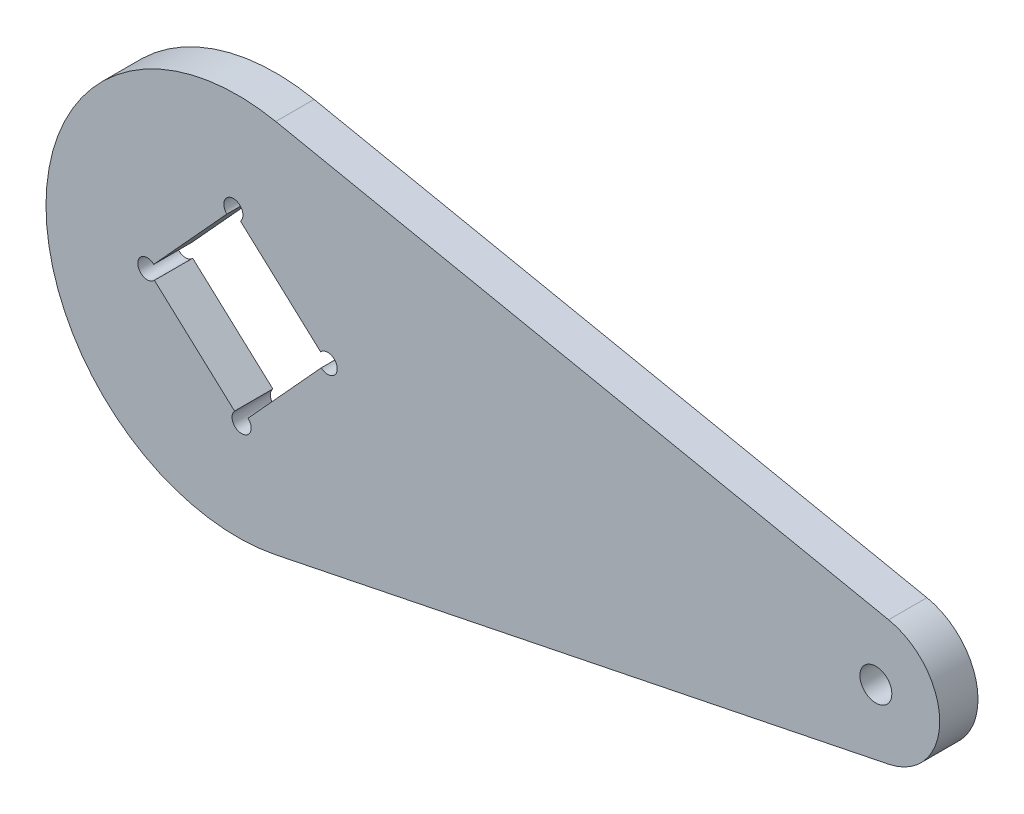
ISO-10303-21;
HEADER;
FILE_DESCRIPTION(('STEP AP214'),'2;1');
FILE_NAME('part.step','',(''),(''),'','','');
FILE_SCHEMA(('AUTOMOTIVE_DESIGN { 1 0 10303 214 1 1 1 1 }'));
ENDSEC;
DATA;
#1=APPLICATION_CONTEXT('core data for automotive mechanical design processes');
#2=APPLICATION_PROTOCOL_DEFINITION('international standard','automotive_design',2000,#1);
#3=PRODUCT_CONTEXT('',#1,'mechanical');
#4=PRODUCT('Part','Part','',(#3));
#5=PRODUCT_RELATED_PRODUCT_CATEGORY('part','',(#4));
#6=PRODUCT_DEFINITION_FORMATION('','',#4);
#7=PRODUCT_DEFINITION_CONTEXT('part definition',#1,'design');
#8=PRODUCT_DEFINITION('design','',#6,#7);
#9=PRODUCT_DEFINITION_SHAPE('','',#8);
#10=(LENGTH_UNIT() NAMED_UNIT(*) SI_UNIT(.MILLI.,.METRE.));
#11=(NAMED_UNIT(*) PLANE_ANGLE_UNIT() SI_UNIT($,.RADIAN.));
#12=(NAMED_UNIT(*) SI_UNIT($,.STERADIAN.) SOLID_ANGLE_UNIT());
#13=UNCERTAINTY_MEASURE_WITH_UNIT(LENGTH_MEASURE(1.E-05),#10,'distance_accuracy_value','');
#14=(GEOMETRIC_REPRESENTATION_CONTEXT(3) GLOBAL_UNCERTAINTY_ASSIGNED_CONTEXT((#13)) GLOBAL_UNIT_ASSIGNED_CONTEXT((#10,
#11,#12)) REPRESENTATION_CONTEXT('',''));
#15=CARTESIAN_POINT('',(0.,0.,0.));
#16=DIRECTION('',(0.,0.,1.));
#17=DIRECTION('',(1.,0.,0.));
#18=AXIS2_PLACEMENT_3D('',#15,#16,#17);
#19=CARTESIAN_POINT('',(6.,-29.3938769133981,6.));
#20=DIRECTION('',(-0.2,0.979795897113271,0.));
#21=DIRECTION('',(-0.979795897113271,-0.2,0.));
#22=AXIS2_PLACEMENT_3D('',#19,#20,#21);
#23=PLANE('',#22);
#24=DIRECTION('',(0.979795897113271,0.2,0.));
#25=VECTOR('',#24,1.);
#26=CARTESIAN_POINT('',(6.,-29.3938769133981,0.));
#27=LINE('',#26,#25);
#28=CARTESIAN_POINT('',(6.,-29.3938769133981,0.));
#29=VERTEX_POINT('',#28);
#30=CARTESIAN_POINT('',(102.,-9.79795897113271,0.));
#31=VERTEX_POINT('',#30);
#32=EDGE_CURVE('E185',#29,#31,#27,.T.);
#33=ORIENTED_EDGE('',*,*,#32,.T.);
#34=DIRECTION('',(0.,0.,-1.));
#35=VECTOR('',#34,1.);
#36=CARTESIAN_POINT('',(102.,-9.79795897113271,6.));
#37=LINE('',#36,#35);
#38=CARTESIAN_POINT('',(102.,-9.79795897113271,6.));
#39=VERTEX_POINT('',#38);
#40=EDGE_CURVE('E11',#39,#31,#37,.T.);
#41=ORIENTED_EDGE('',*,*,#40,.F.);
#42=DIRECTION('',(0.979795897113271,0.2,0.));
#43=VECTOR('',#42,1.);
#44=CARTESIAN_POINT('',(6.,-29.3938769133981,6.));
#45=LINE('',#44,#43);
#46=CARTESIAN_POINT('',(6.,-29.3938769133981,6.));
#47=VERTEX_POINT('',#46);
#48=EDGE_CURVE('E141',#47,#39,#45,.T.);
#49=ORIENTED_EDGE('',*,*,#48,.F.);
#50=DIRECTION('',(0.,0.,-1.));
#51=VECTOR('',#50,1.);
#52=CARTESIAN_POINT('',(6.,-29.3938769133981,6.));
#53=LINE('',#52,#51);
#54=EDGE_CURVE('E193',#47,#29,#53,.T.);
#55=ORIENTED_EDGE('',*,*,#54,.T.);
#56=EDGE_LOOP('',(#33,#41,#49,#55));
#57=FACE_BOUND('',#56,.T.);
#58=ADVANCED_FACE('F40',(#57),#23,.F.);
#59=CARTESIAN_POINT('',(100.,0.,6.));
#60=DIRECTION('',(0.,0.,-1.));
#61=DIRECTION('',(-1.,0.,0.));
#62=AXIS2_PLACEMENT_3D('',#59,#60,#61);
#63=CYLINDRICAL_SURFACE('',#62,10.);
#64=CARTESIAN_POINT('',(100.,0.,0.));
#65=DIRECTION('',(0.,0.,1.));
#66=DIRECTION('',(1.,0.,0.));
#67=AXIS2_PLACEMENT_3D('',#64,#65,#66);
#68=CIRCLE('',#67,10.);
#69=CARTESIAN_POINT('',(102.,9.79795897113271,0.));
#70=VERTEX_POINT('',#69);
#71=EDGE_CURVE('E147',#31,#70,#68,.T.);
#72=ORIENTED_EDGE('',*,*,#71,.T.);
#73=DIRECTION('',(0.,0.,-1.));
#74=VECTOR('',#73,1.);
#75=CARTESIAN_POINT('',(102.,9.79795897113271,6.));
#76=LINE('',#75,#74);
#77=CARTESIAN_POINT('',(102.,9.79795897113271,6.));
#78=VERTEX_POINT('',#77);
#79=EDGE_CURVE('E50',#78,#70,#76,.T.);
#80=ORIENTED_EDGE('',*,*,#79,.F.);
#81=CARTESIAN_POINT('',(100.,0.,6.));
#82=DIRECTION('',(0.,0.,1.));
#83=DIRECTION('',(1.,0.,0.));
#84=AXIS2_PLACEMENT_3D('',#81,#82,#83);
#85=CIRCLE('',#84,10.);
#86=EDGE_CURVE('E135',#39,#78,#85,.T.);
#87=ORIENTED_EDGE('',*,*,#86,.F.);
#88=ORIENTED_EDGE('',*,*,#40,.T.);
#89=EDGE_LOOP('',(#72,#80,#87,#88));
#90=FACE_BOUND('',#89,.T.);
#91=ADVANCED_FACE('F146',(#90),#63,.T.);
#92=CARTESIAN_POINT('',(6.,29.3938769133981,6.));
#93=DIRECTION('',(0.2,0.979795897113271,0.));
#94=DIRECTION('',(-0.979795897113271,0.2,0.));
#95=AXIS2_PLACEMENT_3D('',#92,#93,#94);
#96=PLANE('',#95);
#97=DIRECTION('',(0.979795897113271,-0.2,0.));
#98=VECTOR('',#97,1.);
#99=CARTESIAN_POINT('',(6.,29.3938769133981,0.));
#100=LINE('',#99,#98);
#101=CARTESIAN_POINT('',(6.,29.3938769133981,0.));
#102=VERTEX_POINT('',#101);
#103=EDGE_CURVE('E189',#102,#70,#100,.T.);
#104=ORIENTED_EDGE('',*,*,#103,.F.);
#105=DIRECTION('',(0.,0.,-1.));
#106=VECTOR('',#105,1.);
#107=CARTESIAN_POINT('',(6.,29.3938769133981,6.));
#108=LINE('',#107,#106);
#109=CARTESIAN_POINT('',(6.,29.3938769133981,6.));
#110=VERTEX_POINT('',#109);
#111=EDGE_CURVE('E99',#110,#102,#108,.T.);
#112=ORIENTED_EDGE('',*,*,#111,.F.);
#113=DIRECTION('',(0.979795897113271,-0.2,0.));
#114=VECTOR('',#113,1.);
#115=CARTESIAN_POINT('',(6.,29.3938769133981,6.));
#116=LINE('',#115,#114);
#117=EDGE_CURVE('E139',#110,#78,#116,.T.);
#118=ORIENTED_EDGE('',*,*,#117,.T.);
#119=ORIENTED_EDGE('',*,*,#79,.T.);
#120=EDGE_LOOP('',(#104,#112,#118,#119));
#121=FACE_BOUND('',#120,.T.);
#122=ADVANCED_FACE('F152',(#121),#96,.T.);
#123=CARTESIAN_POINT('',(0.646460946015319,-14.1273524853483,6.));
#124=DIRECTION('',(0.,0.,-1.));
#125=DIRECTION('',(-1.,0.,0.));
#126=AXIS2_PLACEMENT_3D('',#123,#124,#125);
#127=CYLINDRICAL_SURFACE('',#126,1.5);
#128=CARTESIAN_POINT('',(0.646460946015319,-14.1273524853483,0.));
#129=DIRECTION('',(0.,0.,1.));
#130=DIRECTION('',(1.,0.,0.));
#131=AXIS2_PLACEMENT_3D('',#128,#129,#130);
#132=CIRCLE('',#131,1.5);
#133=CARTESIAN_POINT('',(-0.461575061336954,-13.1162856198983,0.));
#134=VERTEX_POINT('',#133);
#135=CARTESIAN_POINT('',(1.65752781146529,-13.019316477996,0.));
#136=VERTEX_POINT('',#135);
#137=EDGE_CURVE('E158',#134,#136,#132,.T.);
#138=ORIENTED_EDGE('',*,*,#137,.F.);
#139=DIRECTION('',(0.,0.,-1.));
#140=VECTOR('',#139,1.);
#141=CARTESIAN_POINT('',(-0.461575061336954,-13.1162856198983,6.));
#142=LINE('',#141,#140);
#143=CARTESIAN_POINT('',(-0.461575061336954,-13.1162856198983,6.));
#144=VERTEX_POINT('',#143);
#145=EDGE_CURVE('E44',#144,#134,#142,.T.);
#146=ORIENTED_EDGE('',*,*,#145,.F.);
#147=CARTESIAN_POINT('',(0.646460946015319,-14.1273524853483,6.));
#148=DIRECTION('',(0.,0.,1.));
#149=DIRECTION('',(1.,0.,0.));
#150=AXIS2_PLACEMENT_3D('',#147,#148,#149);
#151=CIRCLE('',#150,1.5);
#152=CARTESIAN_POINT('',(1.65752781146529,-13.019316477996,6.));
#153=VERTEX_POINT('',#152);
#154=EDGE_CURVE('E192',#144,#153,#151,.T.);
#155=ORIENTED_EDGE('',*,*,#154,.T.);
#156=DIRECTION('',(0.,0.,-1.));
#157=VECTOR('',#156,1.);
#158=CARTESIAN_POINT('',(1.65752781146529,-13.019316477996,6.));
#159=LINE('',#158,#157);
#160=EDGE_CURVE('E154',#153,#136,#159,.T.);
#161=ORIENTED_EDGE('',*,*,#160,.T.);
#162=EDGE_LOOP('',(#138,#146,#155,#161));
#163=FACE_BOUND('',#162,.T.);
#164=ADVANCED_FACE('F42',(#163),#127,.F.);
#165=CARTESIAN_POINT('',(-6.7404457696665,-7.38690671568182,6.));
#166=DIRECTION('',(0.674044576966649,0.738690671568181,0.));
#167=DIRECTION('',(-0.738690671568181,0.674044576966649,0.));
#168=AXIS2_PLACEMENT_3D('',#165,#166,#167);
#169=PLANE('',#168);
#170=DIRECTION('',(0.738690671568181,-0.674044576966649,0.));
#171=VECTOR('',#170,1.);
#172=CARTESIAN_POINT('',(-6.7404457696665,-7.38690671568182,0.));
#173=LINE('',#172,#171);
#174=CARTESIAN_POINT('',(-13.019316477996,-1.65752781146529,0.));
#175=VERTEX_POINT('',#174);
#176=EDGE_CURVE('E161',#175,#134,#173,.T.);
#177=ORIENTED_EDGE('',*,*,#176,.F.);
#178=DIRECTION('',(0.,0.,-1.));
#179=VECTOR('',#178,1.);
#180=CARTESIAN_POINT('',(-13.019316477996,-1.65752781146529,6.));
#181=LINE('',#180,#179);
#182=CARTESIAN_POINT('',(-13.019316477996,-1.65752781146529,6.));
#183=VERTEX_POINT('',#182);
#184=EDGE_CURVE('E206',#183,#175,#181,.T.);
#185=ORIENTED_EDGE('',*,*,#184,.F.);
#186=DIRECTION('',(0.738690671568181,-0.674044576966649,0.));
#187=VECTOR('',#186,1.);
#188=CARTESIAN_POINT('',(-6.7404457696665,-7.38690671568182,6.));
#189=LINE('',#188,#187);
#190=EDGE_CURVE('E215',#183,#144,#189,.T.);
#191=ORIENTED_EDGE('',*,*,#190,.T.);
#192=ORIENTED_EDGE('',*,*,#145,.T.);
#193=EDGE_LOOP('',(#177,#185,#191,#192));
#194=FACE_BOUND('',#193,.T.);
#195=ADVANCED_FACE('F213',(#194),#169,.T.);
#196=CARTESIAN_POINT('',(-14.1273524853483,-0.64646094601532,6.));
#197=DIRECTION('',(0.,0.,-1.));
#198=DIRECTION('',(-1.,0.,0.));
#199=AXIS2_PLACEMENT_3D('',#196,#197,#198);
#200=CYLINDRICAL_SURFACE('',#199,1.5);
#201=CARTESIAN_POINT('',(-14.1273524853483,-0.64646094601532,0.));
#202=DIRECTION('',(0.,0.,1.));
#203=DIRECTION('',(1.,0.,0.));
#204=AXIS2_PLACEMENT_3D('',#201,#202,#203);
#205=CIRCLE('',#204,1.5);
#206=CARTESIAN_POINT('',(-13.1162856198983,0.46157506133695,0.));
#207=VERTEX_POINT('',#206);
#208=EDGE_CURVE('E164',#207,#175,#205,.T.);
#209=ORIENTED_EDGE('',*,*,#208,.F.);
#210=DIRECTION('',(0.,0.,-1.));
#211=VECTOR('',#210,1.);
#212=CARTESIAN_POINT('',(-13.1162856198983,0.46157506133695,6.));
#213=LINE('',#212,#211);
#214=CARTESIAN_POINT('',(-13.1162856198983,0.46157506133695,6.));
#215=VERTEX_POINT('',#214);
#216=EDGE_CURVE('E205',#215,#207,#213,.T.);
#217=ORIENTED_EDGE('',*,*,#216,.F.);
#218=CARTESIAN_POINT('',(-14.1273524853483,-0.64646094601532,6.));
#219=DIRECTION('',(0.,0.,1.));
#220=DIRECTION('',(1.,0.,0.));
#221=AXIS2_PLACEMENT_3D('',#218,#219,#220);
#222=CIRCLE('',#221,1.5);
#223=EDGE_CURVE('E224',#215,#183,#222,.T.);
#224=ORIENTED_EDGE('',*,*,#223,.T.);
#225=ORIENTED_EDGE('',*,*,#184,.T.);
#226=EDGE_LOOP('',(#209,#217,#224,#225));
#227=FACE_BOUND('',#226,.T.);
#228=ADVANCED_FACE('F221',(#227),#200,.F.);
#229=CARTESIAN_POINT('',(-7.38690671568182,6.7404457696665,6.));
#230=DIRECTION('',(-0.738690671568181,0.674044576966649,0.));
#231=DIRECTION('',(-0.674044576966649,-0.738690671568181,0.));
#232=AXIS2_PLACEMENT_3D('',#229,#230,#231);
#233=PLANE('',#232);
#234=DIRECTION('',(0.674044576966649,0.738690671568181,0.));
#235=VECTOR('',#234,1.);
#236=CARTESIAN_POINT('',(-7.38690671568182,6.7404457696665,0.));
#237=LINE('',#236,#235);
#238=CARTESIAN_POINT('',(-1.6575278114653,13.019316477996,0.));
#239=VERTEX_POINT('',#238);
#240=EDGE_CURVE('E167',#207,#239,#237,.T.);
#241=ORIENTED_EDGE('',*,*,#240,.T.);
#242=DIRECTION('',(0.,0.,-1.));
#243=VECTOR('',#242,1.);
#244=CARTESIAN_POINT('',(-1.6575278114653,13.019316477996,6.));
#245=LINE('',#244,#243);
#246=CARTESIAN_POINT('',(-1.6575278114653,13.019316477996,6.));
#247=VERTEX_POINT('',#246);
#248=EDGE_CURVE('E203',#247,#239,#245,.T.);
#249=ORIENTED_EDGE('',*,*,#248,.F.);
#250=DIRECTION('',(0.674044576966649,0.738690671568181,0.));
#251=VECTOR('',#250,1.);
#252=CARTESIAN_POINT('',(-7.38690671568182,6.7404457696665,6.));
#253=LINE('',#252,#251);
#254=EDGE_CURVE('E227',#215,#247,#253,.T.);
#255=ORIENTED_EDGE('',*,*,#254,.F.);
#256=ORIENTED_EDGE('',*,*,#216,.T.);
#257=EDGE_LOOP('',(#241,#249,#255,#256));
#258=FACE_BOUND('',#257,.T.);
#259=ADVANCED_FACE('F228',(#258),#233,.F.);
#260=CARTESIAN_POINT('',(-0.646460946015323,14.1273524853483,6.));
#261=DIRECTION('',(0.,0.,-1.));
#262=DIRECTION('',(-1.,0.,0.));
#263=AXIS2_PLACEMENT_3D('',#260,#261,#262);
#264=CYLINDRICAL_SURFACE('',#263,1.5);
#265=CARTESIAN_POINT('',(-0.646460946015323,14.1273524853483,0.));
#266=DIRECTION('',(0.,0.,1.));
#267=DIRECTION('',(1.,0.,0.));
#268=AXIS2_PLACEMENT_3D('',#265,#266,#267);
#269=CIRCLE('',#268,1.5);
#270=CARTESIAN_POINT('',(0.461575061336948,13.1162856198983,0.));
#271=VERTEX_POINT('',#270);
#272=EDGE_CURVE('E170',#271,#239,#269,.T.);
#273=ORIENTED_EDGE('',*,*,#272,.F.);
#274=DIRECTION('',(0.,0.,-1.));
#275=VECTOR('',#274,1.);
#276=CARTESIAN_POINT('',(0.461575061336948,13.1162856198983,6.));
#277=LINE('',#276,#275);
#278=CARTESIAN_POINT('',(0.461575061336948,13.1162856198983,6.));
#279=VERTEX_POINT('',#278);
#280=EDGE_CURVE('E201',#279,#271,#277,.T.);
#281=ORIENTED_EDGE('',*,*,#280,.F.);
#282=CARTESIAN_POINT('',(-0.646460946015323,14.1273524853483,6.));
#283=DIRECTION('',(0.,0.,1.));
#284=DIRECTION('',(1.,0.,0.));
#285=AXIS2_PLACEMENT_3D('',#282,#283,#284);
#286=CIRCLE('',#285,1.5);
#287=EDGE_CURVE('E232',#279,#247,#286,.T.);
#288=ORIENTED_EDGE('',*,*,#287,.T.);
#289=ORIENTED_EDGE('',*,*,#248,.T.);
#290=EDGE_LOOP('',(#273,#281,#288,#289));
#291=FACE_BOUND('',#290,.T.);
#292=ADVANCED_FACE('F285',(#291),#264,.F.);
#293=CARTESIAN_POINT('',(6.74044576966649,7.38690671568181,6.));
#294=DIRECTION('',(0.674044576966649,0.738690671568181,0.));
#295=DIRECTION('',(-0.738690671568181,0.674044576966649,0.));
#296=AXIS2_PLACEMENT_3D('',#293,#294,#295);
#297=PLANE('',#296);
#298=DIRECTION('',(0.738690671568181,-0.674044576966649,0.));
#299=VECTOR('',#298,1.);
#300=CARTESIAN_POINT('',(6.74044576966649,7.38690671568181,0.));
#301=LINE('',#300,#299);
#302=CARTESIAN_POINT('',(13.019316477996,1.65752781146529,0.));
#303=VERTEX_POINT('',#302);
#304=EDGE_CURVE('E173',#271,#303,#301,.T.);
#305=ORIENTED_EDGE('',*,*,#304,.T.);
#306=DIRECTION('',(0.,0.,-1.));
#307=VECTOR('',#306,1.);
#308=CARTESIAN_POINT('',(13.019316477996,1.65752781146529,6.));
#309=LINE('',#308,#307);
#310=CARTESIAN_POINT('',(13.019316477996,1.65752781146529,6.));
#311=VERTEX_POINT('',#310);
#312=EDGE_CURVE('E199',#311,#303,#309,.T.);
#313=ORIENTED_EDGE('',*,*,#312,.F.);
#314=DIRECTION('',(0.738690671568181,-0.674044576966649,0.));
#315=VECTOR('',#314,1.);
#316=CARTESIAN_POINT('',(6.74044576966649,7.38690671568181,6.));
#317=LINE('',#316,#315);
#318=EDGE_CURVE('E240',#279,#311,#317,.T.);
#319=ORIENTED_EDGE('',*,*,#318,.F.);
#320=ORIENTED_EDGE('',*,*,#280,.T.);
#321=EDGE_LOOP('',(#305,#313,#319,#320));
#322=FACE_BOUND('',#321,.T.);
#323=ADVANCED_FACE('F281',(#322),#297,.F.);
#324=CARTESIAN_POINT('',(14.1273524853483,0.64646094601532,6.));
#325=DIRECTION('',(0.,0.,-1.));
#326=DIRECTION('',(-1.,0.,0.));
#327=AXIS2_PLACEMENT_3D('',#324,#325,#326);
#328=CYLINDRICAL_SURFACE('',#327,1.5);
#329=CARTESIAN_POINT('',(14.1273524853483,0.64646094601532,0.));
#330=DIRECTION('',(0.,0.,1.));
#331=DIRECTION('',(1.,0.,0.));
#332=AXIS2_PLACEMENT_3D('',#329,#330,#331);
#333=CIRCLE('',#332,1.5);
#334=CARTESIAN_POINT('',(13.1162856198983,-0.461575061336953,0.));
#335=VERTEX_POINT('',#334);
#336=EDGE_CURVE('E176',#335,#303,#333,.T.);
#337=ORIENTED_EDGE('',*,*,#336,.F.);
#338=DIRECTION('',(0.,0.,-1.));
#339=VECTOR('',#338,1.);
#340=CARTESIAN_POINT('',(13.1162856198983,-0.461575061336953,6.));
#341=LINE('',#340,#339);
#342=CARTESIAN_POINT('',(13.1162856198983,-0.461575061336953,6.));
#343=VERTEX_POINT('',#342);
#344=EDGE_CURVE('E197',#343,#335,#341,.T.);
#345=ORIENTED_EDGE('',*,*,#344,.F.);
#346=CARTESIAN_POINT('',(14.1273524853483,0.64646094601532,6.));
#347=DIRECTION('',(0.,0.,1.));
#348=DIRECTION('',(1.,0.,0.));
#349=AXIS2_PLACEMENT_3D('',#346,#347,#348);
#350=CIRCLE('',#349,1.5);
#351=EDGE_CURVE('E242',#343,#311,#350,.T.);
#352=ORIENTED_EDGE('',*,*,#351,.T.);
#353=ORIENTED_EDGE('',*,*,#312,.T.);
#354=EDGE_LOOP('',(#337,#345,#352,#353));
#355=FACE_BOUND('',#354,.T.);
#356=ADVANCED_FACE('F275',(#355),#328,.F.);
#357=CARTESIAN_POINT('',(100.,0.,6.));
#358=DIRECTION('',(0.,0.,-1.));
#359=DIRECTION('',(-1.,0.,0.));
#360=AXIS2_PLACEMENT_3D('',#357,#358,#359);
#361=CYLINDRICAL_SURFACE('',#360,2.5);
#362=CARTESIAN_POINT('',(100.,0.,6.));
#363=DIRECTION('',(0.,0.,1.));
#364=DIRECTION('',(1.,0.,0.));
#365=AXIS2_PLACEMENT_3D('',#362,#363,#364);
#366=CIRCLE('',#365,2.5);
#367=CARTESIAN_POINT('',(102.5,0.,6.));
#368=VERTEX_POINT('',#367);
#369=EDGE_CURVE('E248',#368,#368,#366,.T.);
#370=ORIENTED_EDGE('',*,*,#369,.T.);
#371=EDGE_LOOP('',(#370));
#372=FACE_BOUND('',#371,.T.);
#373=CARTESIAN_POINT('',(100.,0.,0.));
#374=DIRECTION('',(0.,0.,1.));
#375=DIRECTION('',(1.,0.,0.));
#376=AXIS2_PLACEMENT_3D('',#373,#374,#375);
#377=CIRCLE('',#376,2.5);
#378=CARTESIAN_POINT('',(102.5,0.,0.));
#379=VERTEX_POINT('',#378);
#380=EDGE_CURVE('E182',#379,#379,#377,.T.);
#381=ORIENTED_EDGE('',*,*,#380,.F.);
#382=EDGE_LOOP('',(#381));
#383=FACE_BOUND('',#382,.T.);
#384=ADVANCED_FACE('F252',(#372,#383),#361,.F.);
#385=CARTESIAN_POINT('',(7.38690671568182,-6.7404457696665,6.));
#386=DIRECTION('',(-0.738690671568181,0.674044576966649,0.));
#387=DIRECTION('',(-0.674044576966649,-0.738690671568181,0.));
#388=AXIS2_PLACEMENT_3D('',#385,#386,#387);
#389=PLANE('',#388);
#390=DIRECTION('',(0.674044576966649,0.738690671568181,0.));
#391=VECTOR('',#390,1.);
#392=CARTESIAN_POINT('',(7.38690671568182,-6.7404457696665,0.));
#393=LINE('',#392,#391);
#394=EDGE_CURVE('E179',#136,#335,#393,.T.);
#395=ORIENTED_EDGE('',*,*,#394,.F.);
#396=ORIENTED_EDGE('',*,*,#160,.F.);
#397=DIRECTION('',(0.674044576966649,0.738690671568181,0.));
#398=VECTOR('',#397,1.);
#399=CARTESIAN_POINT('',(7.38690671568182,-6.7404457696665,6.));
#400=LINE('',#399,#398);
#401=EDGE_CURVE('E245',#153,#343,#400,.T.);
#402=ORIENTED_EDGE('',*,*,#401,.T.);
#403=ORIENTED_EDGE('',*,*,#344,.T.);
#404=EDGE_LOOP('',(#395,#396,#402,#403));
#405=FACE_BOUND('',#404,.T.);
#406=ADVANCED_FACE('F262',(#405),#389,.T.);
#407=CARTESIAN_POINT('',(0.,0.,6.));
#408=DIRECTION('',(0.,0.,-1.));
#409=DIRECTION('',(-1.,0.,0.));
#410=AXIS2_PLACEMENT_3D('',#407,#408,#409);
#411=CYLINDRICAL_SURFACE('',#410,30.);
#412=CARTESIAN_POINT('',(0.,0.,0.));
#413=DIRECTION('',(0.,0.,1.));
#414=DIRECTION('',(1.,0.,0.));
#415=AXIS2_PLACEMENT_3D('',#412,#413,#414);
#416=CIRCLE('',#415,30.);
#417=EDGE_CURVE('E102',#102,#29,#416,.T.);
#418=ORIENTED_EDGE('',*,*,#417,.T.);
#419=ORIENTED_EDGE('',*,*,#54,.F.);
#420=CARTESIAN_POINT('',(0.,0.,6.));
#421=DIRECTION('',(0.,0.,1.));
#422=DIRECTION('',(1.,0.,0.));
#423=AXIS2_PLACEMENT_3D('',#420,#421,#422);
#424=CIRCLE('',#423,30.);
#425=EDGE_CURVE('E59',#110,#47,#424,.T.);
#426=ORIENTED_EDGE('',*,*,#425,.F.);
#427=ORIENTED_EDGE('',*,*,#111,.T.);
#428=EDGE_LOOP('',(#418,#419,#426,#427));
#429=FACE_BOUND('',#428,.T.);
#430=ADVANCED_FACE('F255',(#429),#411,.T.);
#431=CARTESIAN_POINT('',(0.,0.,6.));
#432=DIRECTION('',(0.,0.,1.));
#433=DIRECTION('',(1.,0.,0.));
#434=AXIS2_PLACEMENT_3D('',#431,#432,#433);
#435=PLANE('',#434);
#436=ORIENTED_EDGE('',*,*,#154,.F.);
#437=ORIENTED_EDGE('',*,*,#190,.F.);
#438=ORIENTED_EDGE('',*,*,#223,.F.);
#439=ORIENTED_EDGE('',*,*,#254,.T.);
#440=ORIENTED_EDGE('',*,*,#287,.F.);
#441=ORIENTED_EDGE('',*,*,#318,.T.);
#442=ORIENTED_EDGE('',*,*,#351,.F.);
#443=ORIENTED_EDGE('',*,*,#401,.F.);
#444=EDGE_LOOP('',(#436,#437,#438,#439,#440,#441,#442,#443));
#445=FACE_BOUND('',#444,.T.);
#446=ORIENTED_EDGE('',*,*,#369,.F.);
#447=EDGE_LOOP('',(#446));
#448=FACE_BOUND('',#447,.T.);
#449=ORIENTED_EDGE('',*,*,#48,.T.);
#450=ORIENTED_EDGE('',*,*,#86,.T.);
#451=ORIENTED_EDGE('',*,*,#117,.F.);
#452=ORIENTED_EDGE('',*,*,#425,.T.);
#453=EDGE_LOOP('',(#449,#450,#451,#452));
#454=FACE_BOUND('',#453,.T.);
#455=ADVANCED_FACE('F137',(#445,#448,#454),#435,.T.);
#456=CARTESIAN_POINT('',(0.,0.,0.));
#457=DIRECTION('',(0.,0.,1.));
#458=DIRECTION('',(1.,0.,0.));
#459=AXIS2_PLACEMENT_3D('',#456,#457,#458);
#460=PLANE('',#459);
#461=ORIENTED_EDGE('',*,*,#137,.T.);
#462=ORIENTED_EDGE('',*,*,#394,.T.);
#463=ORIENTED_EDGE('',*,*,#336,.T.);
#464=ORIENTED_EDGE('',*,*,#304,.F.);
#465=ORIENTED_EDGE('',*,*,#272,.T.);
#466=ORIENTED_EDGE('',*,*,#240,.F.);
#467=ORIENTED_EDGE('',*,*,#208,.T.);
#468=ORIENTED_EDGE('',*,*,#176,.T.);
#469=EDGE_LOOP('',(#461,#462,#463,#464,#465,#466,#467,#468));
#470=FACE_BOUND('',#469,.T.);
#471=ORIENTED_EDGE('',*,*,#380,.T.);
#472=EDGE_LOOP('',(#471));
#473=FACE_BOUND('',#472,.T.);
#474=ORIENTED_EDGE('',*,*,#32,.F.);
#475=ORIENTED_EDGE('',*,*,#417,.F.);
#476=ORIENTED_EDGE('',*,*,#103,.T.);
#477=ORIENTED_EDGE('',*,*,#71,.F.);
#478=EDGE_LOOP('',(#474,#475,#476,#477));
#479=FACE_BOUND('',#478,.T.);
#480=ADVANCED_FACE('F218',(#470,#473,#479),#460,.F.);
#481=CLOSED_SHELL('',(#58,#91,#122,#164,#195,#228,#259,#292,#323,#356,#384,#406,#430,#455,#480));
#482=MANIFOLD_SOLID_BREP('B2',#481);
#483=ADVANCED_BREP_SHAPE_REPRESENTATION('',(#18,#482),#14);
#484=SHAPE_DEFINITION_REPRESENTATION(#9,#483);
ENDSEC;
END-ISO-10303-21;
